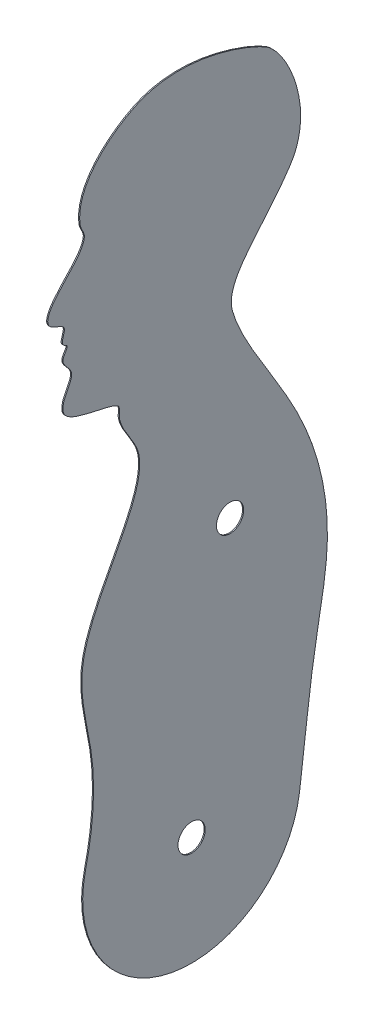
ISO-10303-21;
HEADER;
FILE_DESCRIPTION(('STEP AP214'),'2;1');
FILE_NAME('part.step','',(''),(''),'','','');
FILE_SCHEMA(('AUTOMOTIVE_DESIGN { 1 0 10303 214 1 1 1 1 }'));
ENDSEC;
DATA;
#1=APPLICATION_CONTEXT('core data for automotive mechanical design processes');
#2=APPLICATION_PROTOCOL_DEFINITION('international standard','automotive_design',2000,#1);
#3=PRODUCT_CONTEXT('',#1,'mechanical');
#4=PRODUCT('Part','Part','',(#3));
#5=PRODUCT_RELATED_PRODUCT_CATEGORY('part','',(#4));
#6=PRODUCT_DEFINITION_FORMATION('','',#4);
#7=PRODUCT_DEFINITION_CONTEXT('part definition',#1,'design');
#8=PRODUCT_DEFINITION('design','',#6,#7);
#9=PRODUCT_DEFINITION_SHAPE('','',#8);
#10=(LENGTH_UNIT() NAMED_UNIT(*) SI_UNIT(.MILLI.,.METRE.));
#11=(NAMED_UNIT(*) PLANE_ANGLE_UNIT() SI_UNIT($,.RADIAN.));
#12=(NAMED_UNIT(*) SI_UNIT($,.STERADIAN.) SOLID_ANGLE_UNIT());
#13=UNCERTAINTY_MEASURE_WITH_UNIT(LENGTH_MEASURE(1.E-05),#10,'distance_accuracy_value','');
#14=(GEOMETRIC_REPRESENTATION_CONTEXT(3) GLOBAL_UNCERTAINTY_ASSIGNED_CONTEXT((#13)) GLOBAL_UNIT_ASSIGNED_CONTEXT((#10,
#11,#12)) REPRESENTATION_CONTEXT('',''));
#15=CARTESIAN_POINT('',(0.,0.,0.));
#16=DIRECTION('',(0.,0.,1.));
#17=DIRECTION('',(1.,0.,0.));
#18=AXIS2_PLACEMENT_3D('',#15,#16,#17);
#19=CARTESIAN_POINT('',(0.5,301.544978648811,-90.5763440781532));
#20=DIRECTION('',(-1.,0.,0.));
#21=DIRECTION('',(0.,0.,1.));
#22=AXIS2_PLACEMENT_3D('',#19,#20,#21);
#23=PLANE('',#22);
#24=CARTESIAN_POINT('',(0.5,-13.3893100284168,-99.099578086705));
#25=CARTESIAN_POINT('',(0.5,23.0114105812295,-104.017666971745));
#26=CARTESIAN_POINT('',(0.5,83.6109925910825,-109.630861187037));
#27=CARTESIAN_POINT('',(0.5,185.953055104553,-132.416167229655));
#28=CARTESIAN_POINT('',(0.5,291.436605236442,-106.617940025076));
#29=CARTESIAN_POINT('',(0.5,369.399968924413,-45.8134709516396));
#30=CARTESIAN_POINT('',(0.5,427.026495123498,-30.0399624152298));
#31=CARTESIAN_POINT('',(0.5,452.480800272099,-66.532874137218));
#32=CARTESIAN_POINT('',(0.5,524.632643895986,-113.586742991712));
#33=CARTESIAN_POINT('',(0.5,580.015092802389,-89.5891084013529));
#34=CARTESIAN_POINT('',(0.5,593.676232133099,-69.2753749376711));
#35=B_SPLINE_CURVE_WITH_KNOTS('',3,(#24,#25,#26,#27,#28,#29,#30,#31,#32,#33,#34),.UNSPECIFIED.,
.F.,.F.,(4,1,1,1,2,2,4),(0.,0.172373302460852,0.285416564984079,0.484157148801064,
0.676146621511163,0.843591623819057,1.),.UNSPECIFIED.);
#36=CARTESIAN_POINT('',(0.5,-13.3893100284168,-99.099578086705));
#37=VERTEX_POINT('',#36);
#38=CARTESIAN_POINT('',(0.5,593.676232133099,-69.2753749376711));
#39=VERTEX_POINT('',#38);
#40=EDGE_CURVE('E77',#37,#39,#35,.T.);
#41=ORIENTED_EDGE('',*,*,#40,.T.);
#42=CARTESIAN_POINT('',(0.5,593.676232133099,-69.2753749376711));
#43=CARTESIAN_POINT('',(0.5,601.520076574659,-57.6117968524787));
#44=CARTESIAN_POINT('',(0.5,629.51323950098,6.54193906568228));
#45=CARTESIAN_POINT('',(0.5,593.74889947341,78.7941249735766));
#46=CARTESIAN_POINT('',(0.5,568.241122168973,106.08162449165));
#47=CARTESIAN_POINT('',(0.5,534.208211952538,101.890807479048));
#48=CARTESIAN_POINT('',(0.5,530.407936033086,98.1302425154593));
#49=CARTESIAN_POINT('',(0.5,512.185336836404,99.6120098764619));
#50=CARTESIAN_POINT('',(0.5,494.491581687619,126.960547779001));
#51=CARTESIAN_POINT('',(0.5,466.734936205442,135.409739318655));
#52=CARTESIAN_POINT('',(0.5,470.435559185218,108.170746486771));
#53=CARTESIAN_POINT('',(0.5,451.106444442365,121.978079654635));
#54=CARTESIAN_POINT('',(0.5,447.867902387498,111.487572354915));
#55=CARTESIAN_POINT('',(0.5,436.94295707367,123.343503827439));
#56=CARTESIAN_POINT('',(0.5,422.721838345073,100.322805282227));
#57=CARTESIAN_POINT('',(0.5,409.26105100856,119.857922858264));
#58=CARTESIAN_POINT('',(0.5,384.09763203687,115.710119272994));
#59=CARTESIAN_POINT('',(0.5,383.299511471088,75.3451942233453));
#60=CARTESIAN_POINT('',(0.5,374.577856899414,65.0483887649569));
#61=CARTESIAN_POINT('',(0.5,369.630894740202,66.983379611399));
#62=CARTESIAN_POINT('',(0.5,352.792243914773,63.4027678632493));
#63=CARTESIAN_POINT('',(0.5,342.639747816451,52.227992221685));
#64=CARTESIAN_POINT('',(0.5,293.34221796822,38.6625555707433));
#65=CARTESIAN_POINT('',(0.5,209.877209881348,118.805661234288));
#66=CARTESIAN_POINT('',(0.5,110.237143006836,86.5504262131352));
#67=CARTESIAN_POINT('',(0.5,55.9151951233383,89.6912165906882));
#68=CARTESIAN_POINT('',(0.5,22.5786516120749,97.4176805892059));
#69=B_SPLINE_CURVE_WITH_KNOTS('',3,(#42,#43,#44,#45,#46,#47,#48,#49,#50,#51,#52,#53,#54,#55,#56,
#57,#58,#59,#60,#61,#62,#63,#64,#65,#66,#67,#68),.UNSPECIFIED.,.F.,.F.,(4,2,2,2,2,1,1,1,1,1,2,2,
2,2,1,1,4),(0.,0.136131892675242,0.213377530706287,0.225241043009981,0.268361739712796,
0.305382703437659,0.326230764816634,0.332002539471502,0.347546670353282,0.372102163145425,
0.42170743718572,0.477770818487613,0.495457370234803,0.559790087143143,0.766583246183574,
0.871741202744852,1.),.UNSPECIFIED.);
#70=CARTESIAN_POINT('',(0.5,22.5786516120749,97.4176805892059));
#71=VERTEX_POINT('',#70);
#72=EDGE_CURVE('E73',#39,#71,#69,.T.);
#73=ORIENTED_EDGE('',*,*,#72,.T.);
#74=CARTESIAN_POINT('',(0.5,0.,0.));
#75=DIRECTION('',(1.,0.,0.));
#76=DIRECTION('',(0.,0.,-1.));
#77=AXIS2_PLACEMENT_3D('',#74,#75,#76);
#78=CIRCLE('',#77,100.);
#79=EDGE_CURVE('E53',#71,#37,#78,.T.);
#80=ORIENTED_EDGE('',*,*,#79,.T.);
#81=EDGE_LOOP('',(#41,#73,#80));
#82=FACE_BOUND('',#81,.T.);
#83=CARTESIAN_POINT('',(0.5,0.,0.));
#84=DIRECTION('',(1.,0.,0.));
#85=DIRECTION('',(0.,0.,-1.));
#86=AXIS2_PLACEMENT_3D('',#83,#84,#85);
#87=CIRCLE('',#86,12.5);
#88=CARTESIAN_POINT('',(0.5,0.,-12.5));
#89=VERTEX_POINT('',#88);
#90=EDGE_CURVE('E86',#89,#89,#87,.T.);
#91=ORIENTED_EDGE('',*,*,#90,.F.);
#92=EDGE_LOOP('',(#91));
#93=FACE_BOUND('',#92,.T.);
#94=CARTESIAN_POINT('',(0.5,236.415709595022,-35.292326322363));
#95=DIRECTION('',(1.,0.,0.));
#96=DIRECTION('',(0.,0.,-1.));
#97=AXIS2_PLACEMENT_3D('',#94,#95,#96);
#98=CIRCLE('',#97,12.5);
#99=CARTESIAN_POINT('',(0.5,236.415709595022,-47.792326322363));
#100=VERTEX_POINT('',#99);
#101=EDGE_CURVE('E115',#100,#100,#98,.T.);
#102=ORIENTED_EDGE('',*,*,#101,.F.);
#103=EDGE_LOOP('',(#102));
#104=FACE_BOUND('',#103,.T.);
#105=ADVANCED_FACE('F35',(#82,#93,#104),#23,.F.);
#106=CARTESIAN_POINT('',(-0.5,301.544978648811,-90.5763440781532));
#107=DIRECTION('',(-1.,0.,0.));
#108=DIRECTION('',(0.,0.,1.));
#109=AXIS2_PLACEMENT_3D('',#106,#107,#108);
#110=PLANE('',#109);
#111=CARTESIAN_POINT('',(-0.5,0.,0.));
#112=DIRECTION('',(1.,0.,0.));
#113=DIRECTION('',(0.,0.,-1.));
#114=AXIS2_PLACEMENT_3D('',#111,#112,#113);
#115=CIRCLE('',#114,12.5);
#116=CARTESIAN_POINT('',(-0.5,0.,-12.5));
#117=VERTEX_POINT('',#116);
#118=EDGE_CURVE('E90',#117,#117,#115,.T.);
#119=ORIENTED_EDGE('',*,*,#118,.T.);
#120=EDGE_LOOP('',(#119));
#121=FACE_BOUND('',#120,.T.);
#122=CARTESIAN_POINT('',(-0.5,-13.3893100284168,-99.099578086705));
#123=CARTESIAN_POINT('',(-0.5,23.0114105812295,-104.017666971745));
#124=CARTESIAN_POINT('',(-0.5,83.6109925910825,-109.630861187037));
#125=CARTESIAN_POINT('',(-0.5,185.953055104553,-132.416167229655));
#126=CARTESIAN_POINT('',(-0.5,291.436605236442,-106.617940025076));
#127=CARTESIAN_POINT('',(-0.5,369.399968924413,-45.8134709516396));
#128=CARTESIAN_POINT('',(-0.5,427.026495123498,-30.0399624152298));
#129=CARTESIAN_POINT('',(-0.5,452.480800272099,-66.532874137218));
#130=CARTESIAN_POINT('',(-0.5,524.632643895986,-113.586742991712));
#131=CARTESIAN_POINT('',(-0.5,580.015092802389,-89.5891084013529));
#132=CARTESIAN_POINT('',(-0.5,593.676232133099,-69.2753749376711));
#133=B_SPLINE_CURVE_WITH_KNOTS('',3,(#122,#123,#124,#125,#126,#127,#128,#129,#130,#131,#132),
.UNSPECIFIED.,.F.,.F.,(4,1,1,1,2,2,4),(0.,0.172373302460852,0.285416564984079,0.484157148801064,
0.676146621511163,0.843591623819057,1.),.UNSPECIFIED.);
#134=CARTESIAN_POINT('',(-0.5,-13.3893100284168,-99.099578086705));
#135=VERTEX_POINT('',#134);
#136=CARTESIAN_POINT('',(-0.5,593.676232133099,-69.2753749376711));
#137=VERTEX_POINT('',#136);
#138=EDGE_CURVE('E83',#135,#137,#133,.T.);
#139=ORIENTED_EDGE('',*,*,#138,.F.);
#140=CARTESIAN_POINT('',(-0.5,0.,0.));
#141=DIRECTION('',(1.,0.,0.));
#142=DIRECTION('',(0.,0.,-1.));
#143=AXIS2_PLACEMENT_3D('',#140,#141,#142);
#144=CIRCLE('',#143,100.);
#145=CARTESIAN_POINT('',(-0.5,22.5786516120749,97.4176805892059));
#146=VERTEX_POINT('',#145);
#147=EDGE_CURVE('E70',#146,#135,#144,.T.);
#148=ORIENTED_EDGE('',*,*,#147,.F.);
#149=CARTESIAN_POINT('',(-0.5,593.676232133099,-69.2753749376711));
#150=CARTESIAN_POINT('',(-0.5,601.520076574659,-57.6117968524787));
#151=CARTESIAN_POINT('',(-0.5,629.51323950098,6.54193906568228));
#152=CARTESIAN_POINT('',(-0.5,593.74889947341,78.7941249735766));
#153=CARTESIAN_POINT('',(-0.5,568.241122168973,106.08162449165));
#154=CARTESIAN_POINT('',(-0.5,534.208211952538,101.890807479048));
#155=CARTESIAN_POINT('',(-0.5,530.407936033086,98.1302425154593));
#156=CARTESIAN_POINT('',(-0.5,512.185336836404,99.6120098764619));
#157=CARTESIAN_POINT('',(-0.5,494.491581687619,126.960547779001));
#158=CARTESIAN_POINT('',(-0.5,466.734936205442,135.409739318655));
#159=CARTESIAN_POINT('',(-0.5,470.435559185218,108.170746486771));
#160=CARTESIAN_POINT('',(-0.5,451.106444442365,121.978079654635));
#161=CARTESIAN_POINT('',(-0.5,447.867902387498,111.487572354915));
#162=CARTESIAN_POINT('',(-0.5,436.94295707367,123.343503827439));
#163=CARTESIAN_POINT('',(-0.5,422.721838345073,100.322805282227));
#164=CARTESIAN_POINT('',(-0.5,409.26105100856,119.857922858264));
#165=CARTESIAN_POINT('',(-0.5,384.09763203687,115.710119272994));
#166=CARTESIAN_POINT('',(-0.5,383.299511471088,75.3451942233453));
#167=CARTESIAN_POINT('',(-0.5,374.577856899414,65.0483887649569));
#168=CARTESIAN_POINT('',(-0.5,369.630894740202,66.983379611399));
#169=CARTESIAN_POINT('',(-0.5,352.792243914773,63.4027678632493));
#170=CARTESIAN_POINT('',(-0.5,342.639747816451,52.227992221685));
#171=CARTESIAN_POINT('',(-0.5,293.34221796822,38.6625555707433));
#172=CARTESIAN_POINT('',(-0.5,209.877209881348,118.805661234288));
#173=CARTESIAN_POINT('',(-0.5,110.237143006836,86.5504262131352));
#174=CARTESIAN_POINT('',(-0.5,55.9151951233383,89.6912165906882));
#175=CARTESIAN_POINT('',(-0.5,22.5786516120749,97.4176805892059));
#176=B_SPLINE_CURVE_WITH_KNOTS('',3,(#149,#150,#151,#152,#153,#154,#155,#156,#157,#158,#159,
#160,#161,#162,#163,#164,#165,#166,#167,#168,#169,#170,#171,#172,#173,#174,#175),.UNSPECIFIED.,
.F.,.F.,(4,2,2,2,2,1,1,1,1,1,2,2,2,2,1,1,4),(0.,0.136131892675242,0.213377530706287,
0.225241043009981,0.268361739712796,0.305382703437659,0.326230764816634,0.332002539471502,
0.347546670353282,0.372102163145425,0.42170743718572,0.477770818487613,0.495457370234803,
0.559790087143143,0.766583246183574,0.871741202744852,1.),.UNSPECIFIED.);
#177=EDGE_CURVE('E65',#137,#146,#176,.T.);
#178=ORIENTED_EDGE('',*,*,#177,.F.);
#179=EDGE_LOOP('',(#139,#148,#178));
#180=FACE_BOUND('',#179,.T.);
#181=CARTESIAN_POINT('',(-0.5,236.415709595022,-35.292326322363));
#182=DIRECTION('',(1.,0.,0.));
#183=DIRECTION('',(0.,0.,-1.));
#184=AXIS2_PLACEMENT_3D('',#181,#182,#183);
#185=CIRCLE('',#184,12.5);
#186=CARTESIAN_POINT('',(-0.5,236.415709595022,-47.792326322363));
#187=VERTEX_POINT('',#186);
#188=EDGE_CURVE('E113',#187,#187,#185,.T.);
#189=ORIENTED_EDGE('',*,*,#188,.T.);
#190=EDGE_LOOP('',(#189));
#191=FACE_BOUND('',#190,.T.);
#192=ADVANCED_FACE('F106',(#121,#180,#191),#110,.T.);
#193=DIRECTION('',(-1.,0.,0.));
#194=VECTOR('',#193,1.);
#195=SURFACE_OF_LINEAR_EXTRUSION('',#35,#194);
#196=ORIENTED_EDGE('',*,*,#138,.T.);
#197=DIRECTION('',(-1.,0.,0.));
#198=VECTOR('',#197,1.);
#199=CARTESIAN_POINT('',(0.5,593.676232133099,-69.2753749376711));
#200=LINE('',#199,#198);
#201=EDGE_CURVE('E11',#39,#137,#200,.T.);
#202=ORIENTED_EDGE('',*,*,#201,.F.);
#203=ORIENTED_EDGE('',*,*,#40,.F.);
#204=DIRECTION('',(-1.,0.,0.));
#205=VECTOR('',#204,1.);
#206=CARTESIAN_POINT('',(0.5,-13.3893100284168,-99.099578086705));
#207=LINE('',#206,#205);
#208=EDGE_CURVE('E84',#37,#135,#207,.T.);
#209=ORIENTED_EDGE('',*,*,#208,.T.);
#210=EDGE_LOOP('',(#196,#202,#203,#209));
#211=FACE_BOUND('',#210,.T.);
#212=ADVANCED_FACE('F37',(#211),#195,.F.);
#213=DIRECTION('',(-1.,0.,0.));
#214=VECTOR('',#213,1.);
#215=SURFACE_OF_LINEAR_EXTRUSION('',#69,#214);
#216=ORIENTED_EDGE('',*,*,#177,.T.);
#217=DIRECTION('',(-1.,0.,0.));
#218=VECTOR('',#217,1.);
#219=CARTESIAN_POINT('',(0.5,22.5786516120749,97.4176805892059));
#220=LINE('',#219,#218);
#221=EDGE_CURVE('E45',#71,#146,#220,.T.);
#222=ORIENTED_EDGE('',*,*,#221,.F.);
#223=ORIENTED_EDGE('',*,*,#72,.F.);
#224=ORIENTED_EDGE('',*,*,#201,.T.);
#225=EDGE_LOOP('',(#216,#222,#223,#224));
#226=FACE_BOUND('',#225,.T.);
#227=ADVANCED_FACE('F74',(#226),#215,.F.);
#228=CARTESIAN_POINT('',(0.5,0.,0.));
#229=DIRECTION('',(-1.,0.,0.));
#230=DIRECTION('',(0.,0.,1.));
#231=AXIS2_PLACEMENT_3D('',#228,#229,#230);
#232=CYLINDRICAL_SURFACE('',#231,100.);
#233=ORIENTED_EDGE('',*,*,#147,.T.);
#234=ORIENTED_EDGE('',*,*,#208,.F.);
#235=ORIENTED_EDGE('',*,*,#79,.F.);
#236=ORIENTED_EDGE('',*,*,#221,.T.);
#237=EDGE_LOOP('',(#233,#234,#235,#236));
#238=FACE_BOUND('',#237,.T.);
#239=ADVANCED_FACE('F105',(#238),#232,.T.);
#240=CARTESIAN_POINT('',(0.5,0.,0.));
#241=DIRECTION('',(-1.,0.,0.));
#242=DIRECTION('',(0.,0.,1.));
#243=AXIS2_PLACEMENT_3D('',#240,#241,#242);
#244=CYLINDRICAL_SURFACE('',#243,12.5);
#245=ORIENTED_EDGE('',*,*,#90,.T.);
#246=EDGE_LOOP('',(#245));
#247=FACE_BOUND('',#246,.T.);
#248=ORIENTED_EDGE('',*,*,#118,.F.);
#249=EDGE_LOOP('',(#248));
#250=FACE_BOUND('',#249,.T.);
#251=ADVANCED_FACE('F136',(#247,#250),#244,.F.);
#252=CARTESIAN_POINT('',(0.5,236.415709595022,-35.292326322363));
#253=DIRECTION('',(-1.,0.,0.));
#254=DIRECTION('',(0.,0.,1.));
#255=AXIS2_PLACEMENT_3D('',#252,#253,#254);
#256=CYLINDRICAL_SURFACE('',#255,12.5);
#257=ORIENTED_EDGE('',*,*,#101,.T.);
#258=EDGE_LOOP('',(#257));
#259=FACE_BOUND('',#258,.T.);
#260=ORIENTED_EDGE('',*,*,#188,.F.);
#261=EDGE_LOOP('',(#260));
#262=FACE_BOUND('',#261,.T.);
#263=ADVANCED_FACE('F142',(#259,#262),#256,.F.);
#264=CLOSED_SHELL('',(#105,#192,#212,#227,#239,#251,#263));
#265=MANIFOLD_SOLID_BREP('B2',#264);
#266=ADVANCED_BREP_SHAPE_REPRESENTATION('',(#18,#265),#14);
#267=SHAPE_DEFINITION_REPRESENTATION(#9,#266);
ENDSEC;
END-ISO-10303-21;
